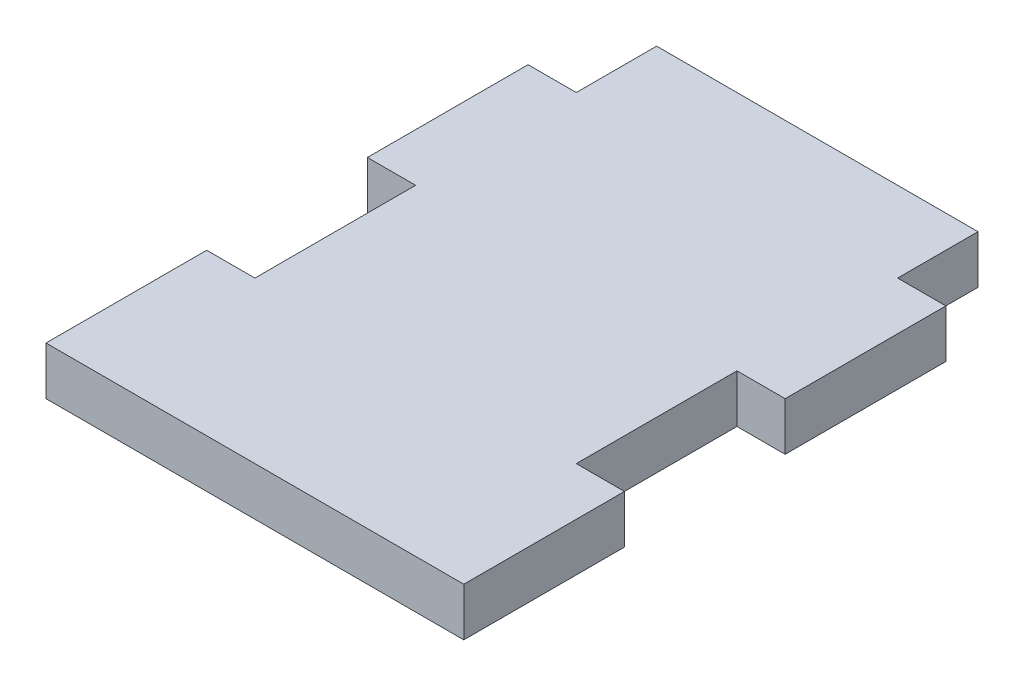
ISO-10303-21;
HEADER;
FILE_DESCRIPTION(('STEP AP214'),'2;1');
FILE_NAME('part.step','',(''),(''),'','','');
FILE_SCHEMA(('AUTOMOTIVE_DESIGN { 1 0 10303 214 1 1 1 1 }'));
ENDSEC;
DATA;
#1=APPLICATION_CONTEXT('core data for automotive mechanical design processes');
#2=APPLICATION_PROTOCOL_DEFINITION('international standard','automotive_design',2000,#1);
#3=PRODUCT_CONTEXT('',#1,'mechanical');
#4=PRODUCT('Part','Part','',(#3));
#5=PRODUCT_RELATED_PRODUCT_CATEGORY('part','',(#4));
#6=PRODUCT_DEFINITION_FORMATION('','',#4);
#7=PRODUCT_DEFINITION_CONTEXT('part definition',#1,'design');
#8=PRODUCT_DEFINITION('design','',#6,#7);
#9=PRODUCT_DEFINITION_SHAPE('','',#8);
#10=(LENGTH_UNIT() NAMED_UNIT(*) SI_UNIT(.MILLI.,.METRE.));
#11=(NAMED_UNIT(*) PLANE_ANGLE_UNIT() SI_UNIT($,.RADIAN.));
#12=(NAMED_UNIT(*) SI_UNIT($,.STERADIAN.) SOLID_ANGLE_UNIT());
#13=UNCERTAINTY_MEASURE_WITH_UNIT(LENGTH_MEASURE(1.E-05),#10,'distance_accuracy_value','');
#14=(GEOMETRIC_REPRESENTATION_CONTEXT(3) GLOBAL_UNCERTAINTY_ASSIGNED_CONTEXT((#13)) GLOBAL_UNIT_ASSIGNED_CONTEXT((#10,
#11,#12)) REPRESENTATION_CONTEXT('',''));
#15=CARTESIAN_POINT('',(0.,0.,0.));
#16=DIRECTION('',(0.,0.,1.));
#17=DIRECTION('',(1.,0.,0.));
#18=AXIS2_PLACEMENT_3D('',#15,#16,#17);
#19=CARTESIAN_POINT('',(-10.,3.,0.));
#20=DIRECTION('',(1.,0.,0.));
#21=DIRECTION('',(0.,0.,-1.));
#22=AXIS2_PLACEMENT_3D('',#19,#20,#21);
#23=PLANE('',#22);
#24=DIRECTION('',(0.,-1.,0.));
#25=VECTOR('',#24,1.);
#26=CARTESIAN_POINT('',(-10.,3.,-12.5));
#27=LINE('',#26,#25);
#28=CARTESIAN_POINT('',(-10.,3.,-12.5));
#29=VERTEX_POINT('',#28);
#30=CARTESIAN_POINT('',(-10.,0.,-12.5));
#31=VERTEX_POINT('',#30);
#32=EDGE_CURVE('E99',#29,#31,#27,.T.);
#33=ORIENTED_EDGE('',*,*,#32,.F.);
#34=DIRECTION('',(0.,0.,1.));
#35=VECTOR('',#34,1.);
#36=CARTESIAN_POINT('',(-10.,3.,0.));
#37=LINE('',#36,#35);
#38=CARTESIAN_POINT('',(-10.,3.,-17.5));
#39=VERTEX_POINT('',#38);
#40=EDGE_CURVE('E253',#39,#29,#37,.T.);
#41=ORIENTED_EDGE('',*,*,#40,.F.);
#42=DIRECTION('',(0.,-1.,0.));
#43=VECTOR('',#42,1.);
#44=CARTESIAN_POINT('',(-10.,3.,-17.5));
#45=LINE('',#44,#43);
#46=CARTESIAN_POINT('',(-10.,0.,-17.5));
#47=VERTEX_POINT('',#46);
#48=EDGE_CURVE('E162',#39,#47,#45,.T.);
#49=ORIENTED_EDGE('',*,*,#48,.T.);
#50=DIRECTION('',(0.,0.,1.));
#51=VECTOR('',#50,1.);
#52=CARTESIAN_POINT('',(-10.,0.,0.));
#53=LINE('',#52,#51);
#54=EDGE_CURVE('E222',#47,#31,#53,.T.);
#55=ORIENTED_EDGE('',*,*,#54,.T.);
#56=EDGE_LOOP('',(#33,#41,#49,#55));
#57=FACE_BOUND('',#56,.T.);
#58=ADVANCED_FACE('F89',(#57),#23,.F.);
#59=CARTESIAN_POINT('',(10.,3.,0.));
#60=DIRECTION('',(1.,0.,0.));
#61=DIRECTION('',(0.,0.,-1.));
#62=AXIS2_PLACEMENT_3D('',#59,#60,#61);
#63=PLANE('',#62);
#64=DIRECTION('',(0.,0.,1.));
#65=VECTOR('',#64,1.);
#66=CARTESIAN_POINT('',(10.,0.,0.));
#67=LINE('',#66,#65);
#68=CARTESIAN_POINT('',(10.,0.,-17.5));
#69=VERTEX_POINT('',#68);
#70=CARTESIAN_POINT('',(10.,0.,-12.5));
#71=VERTEX_POINT('',#70);
#72=EDGE_CURVE('E136',#69,#71,#67,.T.);
#73=ORIENTED_EDGE('',*,*,#72,.F.);
#74=DIRECTION('',(0.,-1.,0.));
#75=VECTOR('',#74,1.);
#76=CARTESIAN_POINT('',(10.,3.,-17.5));
#77=LINE('',#76,#75);
#78=CARTESIAN_POINT('',(10.,3.,-17.5));
#79=VERTEX_POINT('',#78);
#80=EDGE_CURVE('E159',#79,#69,#77,.T.);
#81=ORIENTED_EDGE('',*,*,#80,.F.);
#82=DIRECTION('',(0.,0.,1.));
#83=VECTOR('',#82,1.);
#84=CARTESIAN_POINT('',(10.,3.,0.));
#85=LINE('',#84,#83);
#86=CARTESIAN_POINT('',(10.,3.,-12.5));
#87=VERTEX_POINT('',#86);
#88=EDGE_CURVE('E199',#79,#87,#85,.T.);
#89=ORIENTED_EDGE('',*,*,#88,.T.);
#90=DIRECTION('',(0.,-1.,0.));
#91=VECTOR('',#90,1.);
#92=CARTESIAN_POINT('',(10.,3.,-12.5));
#93=LINE('',#92,#91);
#94=EDGE_CURVE('E192',#87,#71,#93,.T.);
#95=ORIENTED_EDGE('',*,*,#94,.T.);
#96=EDGE_LOOP('',(#73,#81,#89,#95));
#97=FACE_BOUND('',#96,.T.);
#98=ADVANCED_FACE('F366',(#97),#63,.T.);
#99=CARTESIAN_POINT('',(0.,3.,-17.5));
#100=DIRECTION('',(0.,0.,-1.));
#101=DIRECTION('',(-1.,0.,0.));
#102=AXIS2_PLACEMENT_3D('',#99,#100,#101);
#103=PLANE('',#102);
#104=DIRECTION('',(1.,0.,0.));
#105=VECTOR('',#104,1.);
#106=CARTESIAN_POINT('',(0.,0.,-17.5));
#107=LINE('',#106,#105);
#108=EDGE_CURVE('E225',#47,#69,#107,.T.);
#109=ORIENTED_EDGE('',*,*,#108,.F.);
#110=ORIENTED_EDGE('',*,*,#48,.F.);
#111=DIRECTION('',(1.,0.,0.));
#112=VECTOR('',#111,1.);
#113=CARTESIAN_POINT('',(0.,3.,-17.5));
#114=LINE('',#113,#112);
#115=EDGE_CURVE('E257',#39,#79,#114,.T.);
#116=ORIENTED_EDGE('',*,*,#115,.T.);
#117=ORIENTED_EDGE('',*,*,#80,.T.);
#118=EDGE_LOOP('',(#109,#110,#116,#117));
#119=FACE_BOUND('',#118,.T.);
#120=ADVANCED_FACE('F369',(#119),#103,.T.);
#121=CARTESIAN_POINT('',(-10.,3.,-2.49999999999998));
#122=VERTEX_POINT('',#121);
#123=CARTESIAN_POINT('',(-9.99999999999999,3.,7.50000000000002));
#124=VERTEX_POINT('',#123);
#125=EDGE_CURVE('E256',#122,#124,#37,.T.);
#126=ORIENTED_EDGE('',*,*,#125,.F.);
#127=DIRECTION('',(0.,-1.,0.));
#128=VECTOR('',#127,1.);
#129=CARTESIAN_POINT('',(-10.,3.,-2.49999999999998));
#130=LINE('',#129,#128);
#131=CARTESIAN_POINT('',(-10.,0.,-2.49999999999998));
#132=VERTEX_POINT('',#131);
#133=EDGE_CURVE('E12',#122,#132,#130,.T.);
#134=ORIENTED_EDGE('',*,*,#133,.T.);
#135=CARTESIAN_POINT('',(-9.99999999999999,0.,7.50000000000002));
#136=VERTEX_POINT('',#135);
#137=EDGE_CURVE('E224',#132,#136,#53,.T.);
#138=ORIENTED_EDGE('',*,*,#137,.T.);
#139=DIRECTION('',(0.,-1.,0.));
#140=VECTOR('',#139,1.);
#141=CARTESIAN_POINT('',(-9.99999999999999,3.,7.50000000000002));
#142=LINE('',#141,#140);
#143=EDGE_CURVE('E165',#124,#136,#142,.T.);
#144=ORIENTED_EDGE('',*,*,#143,.F.);
#145=EDGE_LOOP('',(#126,#134,#138,#144));
#146=FACE_BOUND('',#145,.T.);
#147=ADVANCED_FACE('F319',(#146),#23,.F.);
#148=CARTESIAN_POINT('',(0.,3.,7.50000000000002));
#149=DIRECTION('',(0.,0.,1.));
#150=DIRECTION('',(1.,0.,0.));
#151=AXIS2_PLACEMENT_3D('',#148,#149,#150);
#152=PLANE('',#151);
#153=DIRECTION('',(-1.,0.,0.));
#154=VECTOR('',#153,1.);
#155=CARTESIAN_POINT('',(0.,0.,7.50000000000002));
#156=LINE('',#155,#154);
#157=CARTESIAN_POINT('',(-13.,0.,7.50000000000002));
#158=VERTEX_POINT('',#157);
#159=EDGE_CURVE('E219',#136,#158,#156,.T.);
#160=ORIENTED_EDGE('',*,*,#159,.T.);
#161=DIRECTION('',(0.,-1.,0.));
#162=VECTOR('',#161,1.);
#163=CARTESIAN_POINT('',(-13.,3.,7.50000000000002));
#164=LINE('',#163,#162);
#165=CARTESIAN_POINT('',(-13.,3.,7.50000000000002));
#166=VERTEX_POINT('',#165);
#167=EDGE_CURVE('E168',#166,#158,#164,.T.);
#168=ORIENTED_EDGE('',*,*,#167,.F.);
#169=DIRECTION('',(-1.,0.,0.));
#170=VECTOR('',#169,1.);
#171=CARTESIAN_POINT('',(0.,3.,7.50000000000002));
#172=LINE('',#171,#170);
#173=EDGE_CURVE('E250',#124,#166,#172,.T.);
#174=ORIENTED_EDGE('',*,*,#173,.F.);
#175=ORIENTED_EDGE('',*,*,#143,.T.);
#176=EDGE_LOOP('',(#160,#168,#174,#175));
#177=FACE_BOUND('',#176,.T.);
#178=ADVANCED_FACE('F327',(#177),#152,.F.);
#179=CARTESIAN_POINT('',(-13.,3.,0.));
#180=DIRECTION('',(-1.,0.,0.));
#181=DIRECTION('',(0.,0.,1.));
#182=AXIS2_PLACEMENT_3D('',#179,#180,#181);
#183=PLANE('',#182);
#184=DIRECTION('',(0.,0.,-1.));
#185=VECTOR('',#184,1.);
#186=CARTESIAN_POINT('',(-13.,0.,0.));
#187=LINE('',#186,#185);
#188=CARTESIAN_POINT('',(-13.,0.,17.5));
#189=VERTEX_POINT('',#188);
#190=EDGE_CURVE('E216',#189,#158,#187,.T.);
#191=ORIENTED_EDGE('',*,*,#190,.F.);
#192=DIRECTION('',(0.,-1.,0.));
#193=VECTOR('',#192,1.);
#194=CARTESIAN_POINT('',(-13.,3.,17.5));
#195=LINE('',#194,#193);
#196=CARTESIAN_POINT('',(-13.,3.,17.5));
#197=VERTEX_POINT('',#196);
#198=EDGE_CURVE('E171',#197,#189,#195,.T.);
#199=ORIENTED_EDGE('',*,*,#198,.F.);
#200=DIRECTION('',(0.,0.,-1.));
#201=VECTOR('',#200,1.);
#202=CARTESIAN_POINT('',(-13.,3.,0.));
#203=LINE('',#202,#201);
#204=EDGE_CURVE('E247',#197,#166,#203,.T.);
#205=ORIENTED_EDGE('',*,*,#204,.T.);
#206=ORIENTED_EDGE('',*,*,#167,.T.);
#207=EDGE_LOOP('',(#191,#199,#205,#206));
#208=FACE_BOUND('',#207,.T.);
#209=ADVANCED_FACE('F406',(#208),#183,.T.);
#210=CARTESIAN_POINT('',(0.,3.,17.5));
#211=DIRECTION('',(0.,0.,-1.));
#212=DIRECTION('',(-1.,0.,0.));
#213=AXIS2_PLACEMENT_3D('',#210,#211,#212);
#214=PLANE('',#213);
#215=DIRECTION('',(1.,0.,0.));
#216=VECTOR('',#215,1.);
#217=CARTESIAN_POINT('',(0.,0.,17.5));
#218=LINE('',#217,#216);
#219=CARTESIAN_POINT('',(13.,0.,17.5));
#220=VERTEX_POINT('',#219);
#221=EDGE_CURVE('E213',#189,#220,#218,.T.);
#222=ORIENTED_EDGE('',*,*,#221,.T.);
#223=DIRECTION('',(0.,-1.,0.));
#224=VECTOR('',#223,1.);
#225=CARTESIAN_POINT('',(13.,3.,17.5));
#226=LINE('',#225,#224);
#227=CARTESIAN_POINT('',(13.,3.,17.5));
#228=VERTEX_POINT('',#227);
#229=EDGE_CURVE('E174',#228,#220,#226,.T.);
#230=ORIENTED_EDGE('',*,*,#229,.F.);
#231=DIRECTION('',(1.,0.,0.));
#232=VECTOR('',#231,1.);
#233=CARTESIAN_POINT('',(0.,3.,17.5));
#234=LINE('',#233,#232);
#235=EDGE_CURVE('E244',#197,#228,#234,.T.);
#236=ORIENTED_EDGE('',*,*,#235,.F.);
#237=ORIENTED_EDGE('',*,*,#198,.T.);
#238=EDGE_LOOP('',(#222,#230,#236,#237));
#239=FACE_BOUND('',#238,.T.);
#240=ADVANCED_FACE('F412',(#239),#214,.F.);
#241=CARTESIAN_POINT('',(13.,3.,0.));
#242=DIRECTION('',(-1.,0.,0.));
#243=DIRECTION('',(0.,0.,1.));
#244=AXIS2_PLACEMENT_3D('',#241,#242,#243);
#245=PLANE('',#244);
#246=DIRECTION('',(0.,0.,-1.));
#247=VECTOR('',#246,1.);
#248=CARTESIAN_POINT('',(13.,0.,0.));
#249=LINE('',#248,#247);
#250=CARTESIAN_POINT('',(13.,0.,7.50000000000002));
#251=VERTEX_POINT('',#250);
#252=EDGE_CURVE('E210',#220,#251,#249,.T.);
#253=ORIENTED_EDGE('',*,*,#252,.T.);
#254=DIRECTION('',(0.,-1.,0.));
#255=VECTOR('',#254,1.);
#256=CARTESIAN_POINT('',(13.,3.,7.50000000000002));
#257=LINE('',#256,#255);
#258=CARTESIAN_POINT('',(13.,3.,7.50000000000002));
#259=VERTEX_POINT('',#258);
#260=EDGE_CURVE('E177',#259,#251,#257,.T.);
#261=ORIENTED_EDGE('',*,*,#260,.F.);
#262=DIRECTION('',(0.,0.,-1.));
#263=VECTOR('',#262,1.);
#264=CARTESIAN_POINT('',(13.,3.,0.));
#265=LINE('',#264,#263);
#266=EDGE_CURVE('E241',#228,#259,#265,.T.);
#267=ORIENTED_EDGE('',*,*,#266,.F.);
#268=ORIENTED_EDGE('',*,*,#229,.T.);
#269=EDGE_LOOP('',(#253,#261,#267,#268));
#270=FACE_BOUND('',#269,.T.);
#271=ADVANCED_FACE('F348',(#270),#245,.F.);
#272=CARTESIAN_POINT('',(0.,3.,7.50000000000002));
#273=DIRECTION('',(0.,0.,-1.));
#274=DIRECTION('',(-1.,0.,0.));
#275=AXIS2_PLACEMENT_3D('',#272,#273,#274);
#276=PLANE('',#275);
#277=DIRECTION('',(1.,0.,0.));
#278=VECTOR('',#277,1.);
#279=CARTESIAN_POINT('',(0.,0.,7.50000000000002));
#280=LINE('',#279,#278);
#281=CARTESIAN_POINT('',(10.,0.,7.50000000000002));
#282=VERTEX_POINT('',#281);
#283=EDGE_CURVE('E207',#282,#251,#280,.T.);
#284=ORIENTED_EDGE('',*,*,#283,.F.);
#285=DIRECTION('',(0.,-1.,0.));
#286=VECTOR('',#285,1.);
#287=CARTESIAN_POINT('',(10.,3.,7.50000000000002));
#288=LINE('',#287,#286);
#289=CARTESIAN_POINT('',(10.,3.,7.50000000000002));
#290=VERTEX_POINT('',#289);
#291=EDGE_CURVE('E180',#290,#282,#288,.T.);
#292=ORIENTED_EDGE('',*,*,#291,.F.);
#293=DIRECTION('',(1.,0.,0.));
#294=VECTOR('',#293,1.);
#295=CARTESIAN_POINT('',(0.,3.,7.50000000000002));
#296=LINE('',#295,#294);
#297=EDGE_CURVE('E238',#290,#259,#296,.T.);
#298=ORIENTED_EDGE('',*,*,#297,.T.);
#299=ORIENTED_EDGE('',*,*,#260,.T.);
#300=EDGE_LOOP('',(#284,#292,#298,#299));
#301=FACE_BOUND('',#300,.T.);
#302=ADVANCED_FACE('F351',(#301),#276,.T.);
#303=CARTESIAN_POINT('',(10.,0.,-2.49999999999998));
#304=VERTEX_POINT('',#303);
#305=EDGE_CURVE('E206',#304,#282,#67,.T.);
#306=ORIENTED_EDGE('',*,*,#305,.F.);
#307=DIRECTION('',(0.,-1.,0.));
#308=VECTOR('',#307,1.);
#309=CARTESIAN_POINT('',(10.,3.,-2.49999999999998));
#310=LINE('',#309,#308);
#311=CARTESIAN_POINT('',(10.,3.,-2.49999999999998));
#312=VERTEX_POINT('',#311);
#313=EDGE_CURVE('E183',#312,#304,#310,.T.);
#314=ORIENTED_EDGE('',*,*,#313,.F.);
#315=EDGE_CURVE('E237',#312,#290,#85,.T.);
#316=ORIENTED_EDGE('',*,*,#315,.T.);
#317=ORIENTED_EDGE('',*,*,#291,.T.);
#318=EDGE_LOOP('',(#306,#314,#316,#317));
#319=FACE_BOUND('',#318,.T.);
#320=ADVANCED_FACE('F272',(#319),#63,.T.);
#321=CARTESIAN_POINT('',(0.,3.,-2.49999999999998));
#322=DIRECTION('',(0.,0.,-1.));
#323=DIRECTION('',(-1.,0.,0.));
#324=AXIS2_PLACEMENT_3D('',#321,#322,#323);
#325=PLANE('',#324);
#326=DIRECTION('',(1.,0.,0.));
#327=VECTOR('',#326,1.);
#328=CARTESIAN_POINT('',(0.,0.,-2.49999999999998));
#329=LINE('',#328,#327);
#330=CARTESIAN_POINT('',(13.,0.,-2.49999999999998));
#331=VERTEX_POINT('',#330);
#332=EDGE_CURVE('E203',#304,#331,#329,.T.);
#333=ORIENTED_EDGE('',*,*,#332,.T.);
#334=DIRECTION('',(0.,-1.,0.));
#335=VECTOR('',#334,1.);
#336=CARTESIAN_POINT('',(13.,3.,-2.49999999999998));
#337=LINE('',#336,#335);
#338=CARTESIAN_POINT('',(13.,3.,-2.49999999999998));
#339=VERTEX_POINT('',#338);
#340=EDGE_CURVE('E186',#339,#331,#337,.T.);
#341=ORIENTED_EDGE('',*,*,#340,.F.);
#342=DIRECTION('',(1.,0.,0.));
#343=VECTOR('',#342,1.);
#344=CARTESIAN_POINT('',(0.,3.,-2.49999999999998));
#345=LINE('',#344,#343);
#346=EDGE_CURVE('E234',#312,#339,#345,.T.);
#347=ORIENTED_EDGE('',*,*,#346,.F.);
#348=ORIENTED_EDGE('',*,*,#313,.T.);
#349=EDGE_LOOP('',(#333,#341,#347,#348));
#350=FACE_BOUND('',#349,.T.);
#351=ADVANCED_FACE('F356',(#350),#325,.F.);
#352=CARTESIAN_POINT('',(13.,3.,0.));
#353=DIRECTION('',(-1.,0.,0.));
#354=DIRECTION('',(0.,0.,1.));
#355=AXIS2_PLACEMENT_3D('',#352,#353,#354);
#356=PLANE('',#355);
#357=DIRECTION('',(0.,0.,-1.));
#358=VECTOR('',#357,1.);
#359=CARTESIAN_POINT('',(13.,0.,0.));
#360=LINE('',#359,#358);
#361=CARTESIAN_POINT('',(13.,0.,-12.5));
#362=VERTEX_POINT('',#361);
#363=EDGE_CURVE('E200',#331,#362,#360,.T.);
#364=ORIENTED_EDGE('',*,*,#363,.T.);
#365=DIRECTION('',(0.,-1.,0.));
#366=VECTOR('',#365,1.);
#367=CARTESIAN_POINT('',(13.,3.,-12.5));
#368=LINE('',#367,#366);
#369=CARTESIAN_POINT('',(13.,3.,-12.5));
#370=VERTEX_POINT('',#369);
#371=EDGE_CURVE('E189',#370,#362,#368,.T.);
#372=ORIENTED_EDGE('',*,*,#371,.F.);
#373=DIRECTION('',(0.,0.,-1.));
#374=VECTOR('',#373,1.);
#375=CARTESIAN_POINT('',(13.,3.,0.));
#376=LINE('',#375,#374);
#377=EDGE_CURVE('E231',#339,#370,#376,.T.);
#378=ORIENTED_EDGE('',*,*,#377,.F.);
#379=ORIENTED_EDGE('',*,*,#340,.T.);
#380=EDGE_LOOP('',(#364,#372,#378,#379));
#381=FACE_BOUND('',#380,.T.);
#382=ADVANCED_FACE('F359',(#381),#356,.F.);
#383=CARTESIAN_POINT('',(0.,3.,-12.5));
#384=DIRECTION('',(0.,0.,-1.));
#385=DIRECTION('',(-1.,0.,0.));
#386=AXIS2_PLACEMENT_3D('',#383,#384,#385);
#387=PLANE('',#386);
#388=DIRECTION('',(1.,0.,0.));
#389=VECTOR('',#388,1.);
#390=CARTESIAN_POINT('',(0.,0.,-12.5));
#391=LINE('',#390,#389);
#392=EDGE_CURVE('E196',#71,#362,#391,.T.);
#393=ORIENTED_EDGE('',*,*,#392,.F.);
#394=ORIENTED_EDGE('',*,*,#94,.F.);
#395=DIRECTION('',(1.,0.,0.));
#396=VECTOR('',#395,1.);
#397=CARTESIAN_POINT('',(0.,3.,-12.5));
#398=LINE('',#397,#396);
#399=EDGE_CURVE('E195',#87,#370,#398,.T.);
#400=ORIENTED_EDGE('',*,*,#399,.T.);
#401=ORIENTED_EDGE('',*,*,#371,.T.);
#402=EDGE_LOOP('',(#393,#394,#400,#401));
#403=FACE_BOUND('',#402,.T.);
#404=ADVANCED_FACE('F364',(#403),#387,.T.);
#405=CARTESIAN_POINT('',(0.,3.,0.));
#406=DIRECTION('',(0.,1.,0.));
#407=DIRECTION('',(0.,0.,1.));
#408=AXIS2_PLACEMENT_3D('',#405,#406,#407);
#409=PLANE('',#408);
#410=ORIENTED_EDGE('',*,*,#88,.F.);
#411=ORIENTED_EDGE('',*,*,#115,.F.);
#412=ORIENTED_EDGE('',*,*,#40,.T.);
#413=DIRECTION('',(-1.,0.,0.));
#414=VECTOR('',#413,1.);
#415=CARTESIAN_POINT('',(-10.,3.,-12.5));
#416=LINE('',#415,#414);
#417=CARTESIAN_POINT('',(-13.,3.,-12.5));
#418=VERTEX_POINT('',#417);
#419=EDGE_CURVE('E154',#29,#418,#416,.T.);
#420=ORIENTED_EDGE('',*,*,#419,.T.);
#421=DIRECTION('',(0.,0.,-1.));
#422=VECTOR('',#421,1.);
#423=CARTESIAN_POINT('',(-13.,3.,-2.49999999999998));
#424=LINE('',#423,#422);
#425=CARTESIAN_POINT('',(-13.,3.,-2.49999999999998));
#426=VERTEX_POINT('',#425);
#427=EDGE_CURVE('E133',#426,#418,#424,.T.);
#428=ORIENTED_EDGE('',*,*,#427,.F.);
#429=DIRECTION('',(-1.,0.,0.));
#430=VECTOR('',#429,1.);
#431=CARTESIAN_POINT('',(-10.,3.,-2.49999999999998));
#432=LINE('',#431,#430);
#433=EDGE_CURVE('E145',#122,#426,#432,.T.);
#434=ORIENTED_EDGE('',*,*,#433,.F.);
#435=ORIENTED_EDGE('',*,*,#125,.T.);
#436=ORIENTED_EDGE('',*,*,#173,.T.);
#437=ORIENTED_EDGE('',*,*,#204,.F.);
#438=ORIENTED_EDGE('',*,*,#235,.T.);
#439=ORIENTED_EDGE('',*,*,#266,.T.);
#440=ORIENTED_EDGE('',*,*,#297,.F.);
#441=ORIENTED_EDGE('',*,*,#315,.F.);
#442=ORIENTED_EDGE('',*,*,#346,.T.);
#443=ORIENTED_EDGE('',*,*,#377,.T.);
#444=ORIENTED_EDGE('',*,*,#399,.F.);
#445=EDGE_LOOP('',(#410,#411,#412,#420,#428,#434,#435,#436,#437,#438,#439,#440,#441,#442,#443,#444));
#446=FACE_BOUND('',#445,.T.);
#447=ADVANCED_FACE('F282',(#446),#409,.T.);
#448=CARTESIAN_POINT('',(0.,0.,0.));
#449=DIRECTION('',(0.,1.,0.));
#450=DIRECTION('',(0.,0.,1.));
#451=AXIS2_PLACEMENT_3D('',#448,#449,#450);
#452=PLANE('',#451);
#453=ORIENTED_EDGE('',*,*,#72,.T.);
#454=ORIENTED_EDGE('',*,*,#392,.T.);
#455=ORIENTED_EDGE('',*,*,#363,.F.);
#456=ORIENTED_EDGE('',*,*,#332,.F.);
#457=ORIENTED_EDGE('',*,*,#305,.T.);
#458=ORIENTED_EDGE('',*,*,#283,.T.);
#459=ORIENTED_EDGE('',*,*,#252,.F.);
#460=ORIENTED_EDGE('',*,*,#221,.F.);
#461=ORIENTED_EDGE('',*,*,#190,.T.);
#462=ORIENTED_EDGE('',*,*,#159,.F.);
#463=ORIENTED_EDGE('',*,*,#137,.F.);
#464=DIRECTION('',(-1.,0.,0.));
#465=VECTOR('',#464,1.);
#466=CARTESIAN_POINT('',(-10.,0.,-2.49999999999998));
#467=LINE('',#466,#465);
#468=CARTESIAN_POINT('',(-13.,0.,-2.49999999999998));
#469=VERTEX_POINT('',#468);
#470=EDGE_CURVE('E150',#132,#469,#467,.T.);
#471=ORIENTED_EDGE('',*,*,#470,.T.);
#472=DIRECTION('',(0.,0.,-1.));
#473=VECTOR('',#472,1.);
#474=CARTESIAN_POINT('',(-13.,0.,-2.49999999999998));
#475=LINE('',#474,#473);
#476=CARTESIAN_POINT('',(-13.,0.,-12.5));
#477=VERTEX_POINT('',#476);
#478=EDGE_CURVE('E130',#469,#477,#475,.T.);
#479=ORIENTED_EDGE('',*,*,#478,.T.);
#480=DIRECTION('',(-1.,0.,0.));
#481=VECTOR('',#480,1.);
#482=CARTESIAN_POINT('',(-10.,0.,-12.5));
#483=LINE('',#482,#481);
#484=EDGE_CURVE('E139',#31,#477,#483,.T.);
#485=ORIENTED_EDGE('',*,*,#484,.F.);
#486=ORIENTED_EDGE('',*,*,#54,.F.);
#487=ORIENTED_EDGE('',*,*,#108,.T.);
#488=EDGE_LOOP('',(#453,#454,#455,#456,#457,#458,#459,#460,#461,#462,#463,#471,#479,#485,#486,#487));
#489=FACE_BOUND('',#488,.T.);
#490=ADVANCED_FACE('F148',(#489),#452,.F.);
#491=CARTESIAN_POINT('',(-10.,3.,-12.5));
#492=DIRECTION('',(0.,0.,1.));
#493=DIRECTION('',(1.,0.,0.));
#494=AXIS2_PLACEMENT_3D('',#491,#492,#493);
#495=PLANE('',#494);
#496=ORIENTED_EDGE('',*,*,#484,.T.);
#497=DIRECTION('',(0.,-1.,0.));
#498=VECTOR('',#497,1.);
#499=CARTESIAN_POINT('',(-13.,3.,-12.5));
#500=LINE('',#499,#498);
#501=EDGE_CURVE('E126',#418,#477,#500,.T.);
#502=ORIENTED_EDGE('',*,*,#501,.F.);
#503=ORIENTED_EDGE('',*,*,#419,.F.);
#504=ORIENTED_EDGE('',*,*,#32,.T.);
#505=EDGE_LOOP('',(#496,#502,#503,#504));
#506=FACE_BOUND('',#505,.T.);
#507=ADVANCED_FACE('F140',(#506),#495,.F.);
#508=CARTESIAN_POINT('',(-13.,3.,-2.49999999999998));
#509=DIRECTION('',(-1.,0.,0.));
#510=DIRECTION('',(0.,0.,1.));
#511=AXIS2_PLACEMENT_3D('',#508,#509,#510);
#512=PLANE('',#511);
#513=ORIENTED_EDGE('',*,*,#478,.F.);
#514=DIRECTION('',(0.,-1.,0.));
#515=VECTOR('',#514,1.);
#516=CARTESIAN_POINT('',(-13.,3.,-2.49999999999998));
#517=LINE('',#516,#515);
#518=EDGE_CURVE('E93',#426,#469,#517,.T.);
#519=ORIENTED_EDGE('',*,*,#518,.F.);
#520=ORIENTED_EDGE('',*,*,#427,.T.);
#521=ORIENTED_EDGE('',*,*,#501,.T.);
#522=EDGE_LOOP('',(#513,#519,#520,#521));
#523=FACE_BOUND('',#522,.T.);
#524=ADVANCED_FACE('F128',(#523),#512,.T.);
#525=CARTESIAN_POINT('',(-10.,3.,-2.49999999999998));
#526=DIRECTION('',(0.,0.,1.));
#527=DIRECTION('',(1.,0.,0.));
#528=AXIS2_PLACEMENT_3D('',#525,#526,#527);
#529=PLANE('',#528);
#530=ORIENTED_EDGE('',*,*,#470,.F.);
#531=ORIENTED_EDGE('',*,*,#133,.F.);
#532=ORIENTED_EDGE('',*,*,#433,.T.);
#533=ORIENTED_EDGE('',*,*,#518,.T.);
#534=EDGE_LOOP('',(#530,#531,#532,#533));
#535=FACE_BOUND('',#534,.T.);
#536=ADVANCED_FACE('F91',(#535),#529,.T.);
#537=CLOSED_SHELL('',(#58,#98,#120,#147,#178,#209,#240,#271,#302,#320,#351,#382,#404,#447,#490,
#507,#524,#536));
#538=MANIFOLD_SOLID_BREP('B2',#537);
#539=ADVANCED_BREP_SHAPE_REPRESENTATION('',(#18,#538),#14);
#540=SHAPE_DEFINITION_REPRESENTATION(#9,#539);
ENDSEC;
END-ISO-10303-21;
